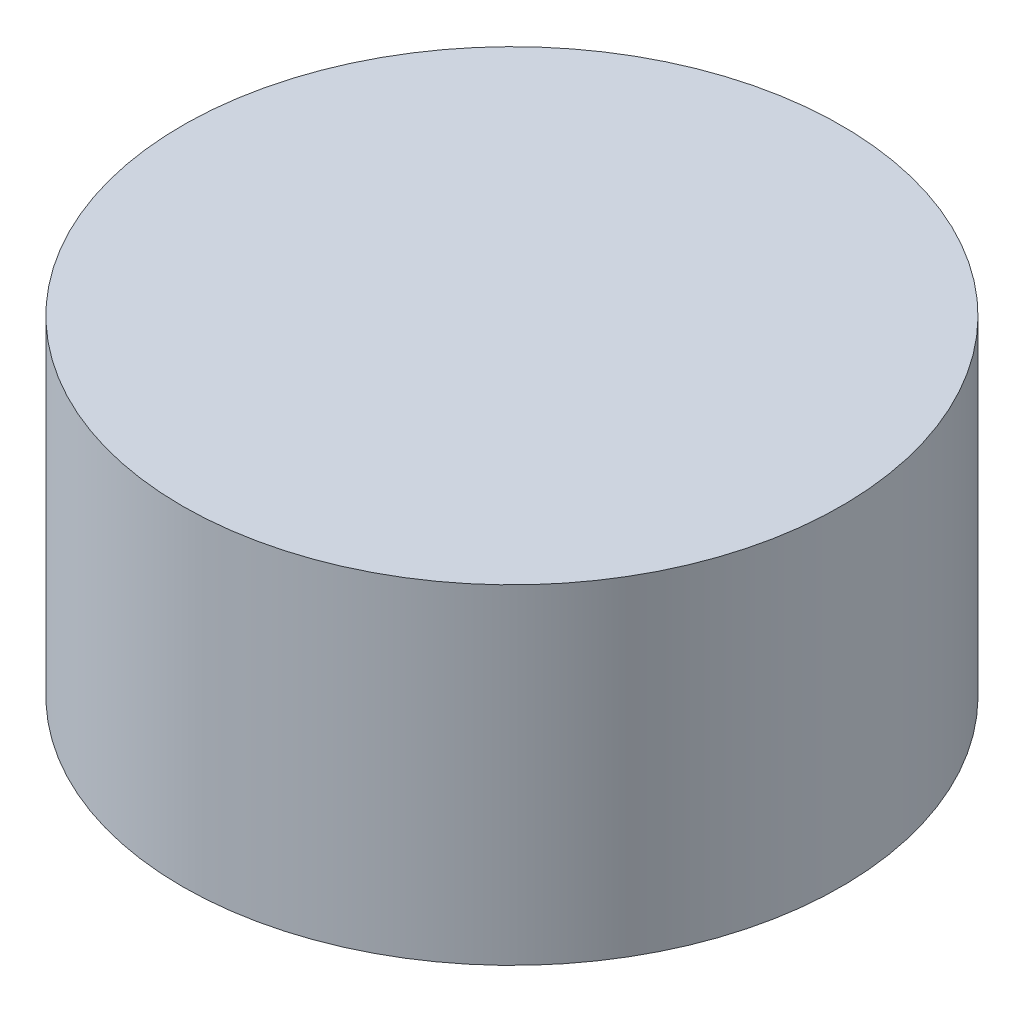
ISO-10303-21;
HEADER;
FILE_DESCRIPTION(('STEP AP214'),'2;1');
FILE_NAME('part.step','',(''),(''),'','','');
FILE_SCHEMA(('AUTOMOTIVE_DESIGN { 1 0 10303 214 1 1 1 1 }'));
ENDSEC;
DATA;
#1=APPLICATION_CONTEXT('core data for automotive mechanical design processes');
#2=APPLICATION_PROTOCOL_DEFINITION('international standard','automotive_design',2000,#1);
#3=PRODUCT_CONTEXT('',#1,'mechanical');
#4=PRODUCT('Part','Part','',(#3));
#5=PRODUCT_RELATED_PRODUCT_CATEGORY('part','',(#4));
#6=PRODUCT_DEFINITION_FORMATION('','',#4);
#7=PRODUCT_DEFINITION_CONTEXT('part definition',#1,'design');
#8=PRODUCT_DEFINITION('design','',#6,#7);
#9=PRODUCT_DEFINITION_SHAPE('','',#8);
#10=(LENGTH_UNIT() NAMED_UNIT(*) SI_UNIT(.MILLI.,.METRE.));
#11=(NAMED_UNIT(*) PLANE_ANGLE_UNIT() SI_UNIT($,.RADIAN.));
#12=(NAMED_UNIT(*) SI_UNIT($,.STERADIAN.) SOLID_ANGLE_UNIT());
#13=UNCERTAINTY_MEASURE_WITH_UNIT(LENGTH_MEASURE(1.E-05),#10,'distance_accuracy_value','');
#14=(GEOMETRIC_REPRESENTATION_CONTEXT(3) GLOBAL_UNCERTAINTY_ASSIGNED_CONTEXT((#13)) GLOBAL_UNIT_ASSIGNED_CONTEXT((#10,
#11,#12)) REPRESENTATION_CONTEXT('',''));
#15=CARTESIAN_POINT('',(0.,0.,0.));
#16=DIRECTION('',(0.,0.,1.));
#17=DIRECTION('',(1.,0.,0.));
#18=AXIS2_PLACEMENT_3D('',#15,#16,#17);
#19=CARTESIAN_POINT('',(0.,0.396875,0.));
#20=DIRECTION('',(0.,-1.,0.));
#21=DIRECTION('',(0.,0.,-1.));
#22=AXIS2_PLACEMENT_3D('',#19,#20,#21);
#23=CYLINDRICAL_SURFACE('',#22,0.396875);
#24=CARTESIAN_POINT('',(0.,0.396875,0.));
#25=DIRECTION('',(0.,1.,0.));
#26=DIRECTION('',(0.,0.,1.));
#27=AXIS2_PLACEMENT_3D('',#24,#25,#26);
#28=CIRCLE('',#27,0.396875);
#29=CARTESIAN_POINT('',(0.,0.396875,0.396875));
#30=VERTEX_POINT('',#29);
#31=EDGE_CURVE('E10',#30,#30,#28,.T.);
#32=ORIENTED_EDGE('',*,*,#31,.F.);
#33=EDGE_LOOP('',(#32));
#34=FACE_BOUND('',#33,.T.);
#35=CARTESIAN_POINT('',(0.,0.,0.));
#36=DIRECTION('',(0.,1.,0.));
#37=DIRECTION('',(0.,0.,1.));
#38=AXIS2_PLACEMENT_3D('',#35,#36,#37);
#39=CIRCLE('',#38,0.396875);
#40=CARTESIAN_POINT('',(0.,0.,0.396875));
#41=VERTEX_POINT('',#40);
#42=EDGE_CURVE('E35',#41,#41,#39,.T.);
#43=ORIENTED_EDGE('',*,*,#42,.T.);
#44=EDGE_LOOP('',(#43));
#45=FACE_BOUND('',#44,.T.);
#46=ADVANCED_FACE('F32',(#34,#45),#23,.T.);
#47=CARTESIAN_POINT('',(0.,0.396875,0.));
#48=DIRECTION('',(0.,1.,0.));
#49=DIRECTION('',(0.,0.,1.));
#50=AXIS2_PLACEMENT_3D('',#47,#48,#49);
#51=PLANE('',#50);
#52=ORIENTED_EDGE('',*,*,#31,.T.);
#53=EDGE_LOOP('',(#52));
#54=FACE_BOUND('',#53,.T.);
#55=ADVANCED_FACE('F47',(#54),#51,.T.);
#56=CARTESIAN_POINT('',(0.,0.,0.));
#57=DIRECTION('',(0.,1.,0.));
#58=DIRECTION('',(0.,0.,1.));
#59=AXIS2_PLACEMENT_3D('',#56,#57,#58);
#60=PLANE('',#59);
#61=ORIENTED_EDGE('',*,*,#42,.F.);
#62=EDGE_LOOP('',(#61));
#63=FACE_BOUND('',#62,.T.);
#64=ADVANCED_FACE('F45',(#63),#60,.F.);
#65=CLOSED_SHELL('',(#46,#55,#64));
#66=MANIFOLD_SOLID_BREP('B2',#65);
#67=ADVANCED_BREP_SHAPE_REPRESENTATION('',(#18,#66),#14);
#68=SHAPE_DEFINITION_REPRESENTATION(#9,#67);
ENDSEC;
END-ISO-10303-21;
